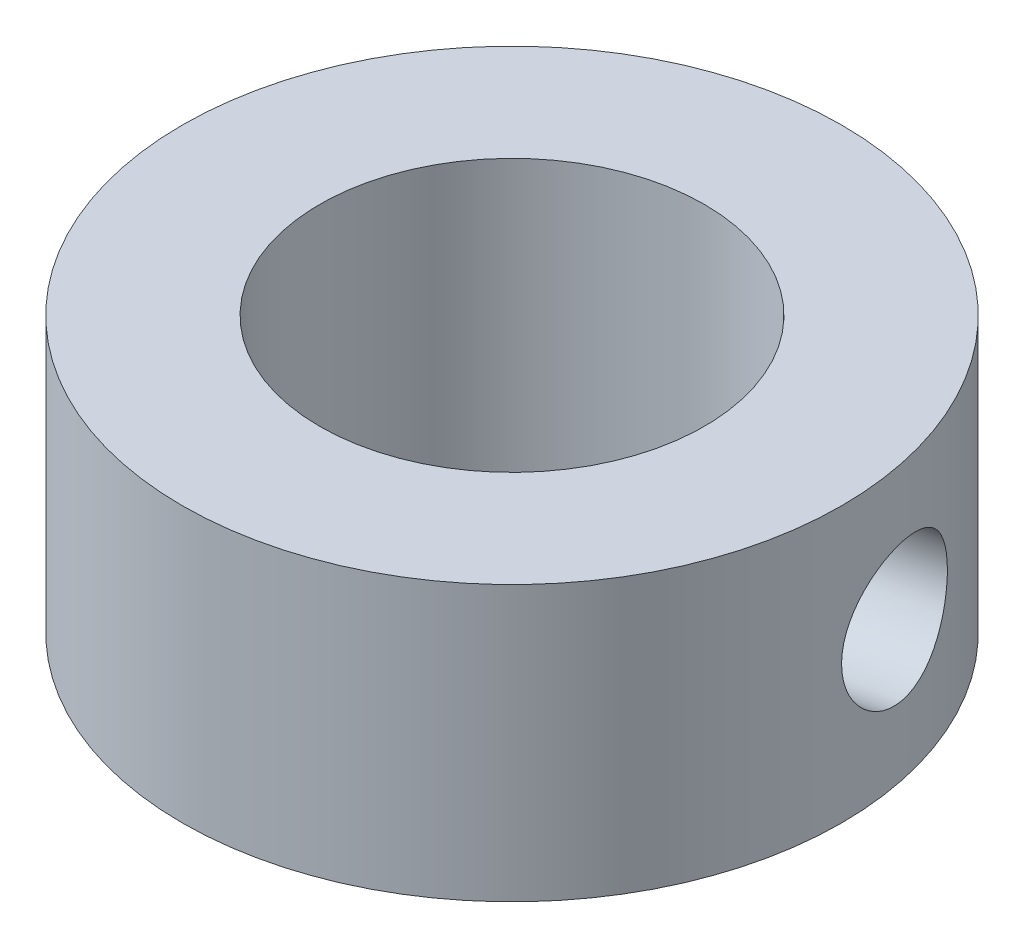
ISO-10303-21;
HEADER;
FILE_DESCRIPTION(('STEP AP214'),'2;1');
FILE_NAME('part.step','',(''),(''),'','','');
FILE_SCHEMA(('AUTOMOTIVE_DESIGN { 1 0 10303 214 1 1 1 1 }'));
ENDSEC;
DATA;
#1=APPLICATION_CONTEXT('core data for automotive mechanical design processes');
#2=APPLICATION_PROTOCOL_DEFINITION('international standard','automotive_design',2000,#1);
#3=PRODUCT_CONTEXT('',#1,'mechanical');
#4=PRODUCT('Part','Part','',(#3));
#5=PRODUCT_RELATED_PRODUCT_CATEGORY('part','',(#4));
#6=PRODUCT_DEFINITION_FORMATION('','',#4);
#7=PRODUCT_DEFINITION_CONTEXT('part definition',#1,'design');
#8=PRODUCT_DEFINITION('design','',#6,#7);
#9=PRODUCT_DEFINITION_SHAPE('','',#8);
#10=(LENGTH_UNIT() NAMED_UNIT(*) SI_UNIT(.MILLI.,.METRE.));
#11=(NAMED_UNIT(*) PLANE_ANGLE_UNIT() SI_UNIT($,.RADIAN.));
#12=(NAMED_UNIT(*) SI_UNIT($,.STERADIAN.) SOLID_ANGLE_UNIT());
#13=UNCERTAINTY_MEASURE_WITH_UNIT(LENGTH_MEASURE(1.E-05),#10,'distance_accuracy_value','');
#14=(GEOMETRIC_REPRESENTATION_CONTEXT(3) GLOBAL_UNCERTAINTY_ASSIGNED_CONTEXT((#13)) GLOBAL_UNIT_ASSIGNED_CONTEXT((#10,
#11,#12)) REPRESENTATION_CONTEXT('',''));
#15=CARTESIAN_POINT('',(0.,0.,0.));
#16=DIRECTION('',(0.,0.,1.));
#17=DIRECTION('',(1.,0.,0.));
#18=AXIS2_PLACEMENT_3D('',#15,#16,#17);
#19=CARTESIAN_POINT('',(0.,-2.5,0.));
#20=DIRECTION('',(0.,1.,0.));
#21=DIRECTION('',(0.,0.,1.));
#22=AXIS2_PLACEMENT_3D('',#19,#20,#21);
#23=CYLINDRICAL_SURFACE('',#22,6.);
#24=CARTESIAN_POINT('',(5.48018686270813,0.00576682418998756,-2.44285733308378));
#25=CARTESIAN_POINT('',(5.480188745192,0.0751574393410179,-2.44285518635812));
#26=CARTESIAN_POINT('',(5.48260932155722,0.144578796205205,-2.43744503012078));
#27=CARTESIAN_POINT('',(5.49211596825202,0.281453141507234,-2.41594603235458));
#28=CARTESIAN_POINT('',(5.49920561485061,0.348904579696409,-2.3998490051526));
#29=CARTESIAN_POINT('',(5.51751947502951,0.479839197024853,-2.35743680735912));
#30=CARTESIAN_POINT('',(5.52873939184858,0.543326420181788,-2.33113225422416));
#31=CARTESIAN_POINT('',(5.5545325227368,0.664691323835585,-2.26898553431602));
#32=CARTESIAN_POINT('',(5.56910560127513,0.722569230920001,-2.23314375301713));
#33=CARTESIAN_POINT('',(5.60087400937813,0.831962199343446,-2.15223601495975));
#34=CARTESIAN_POINT('',(5.61810267071982,0.883378717816451,-2.10704988697842));
#35=CARTESIAN_POINT('',(5.6539570815169,0.977527892838086,-2.00885450249342));
#36=CARTESIAN_POINT('',(5.67258293330265,1.02025991248142,-1.95584467270552));
#37=CARTESIAN_POINT('',(5.7103268013267,1.09621271227284,-1.84275588332418));
#38=CARTESIAN_POINT('',(5.72944781118457,1.12933935065324,-1.78261459316705));
#39=CARTESIAN_POINT('',(5.76695935684096,1.18453287704976,-1.65724328605607));
#40=CARTESIAN_POINT('',(5.78534996672065,1.20660088934351,-1.5920137871756));
#41=CARTESIAN_POINT('',(5.82024832095809,1.23874258530745,-1.45923012477788));
#42=CARTESIAN_POINT('',(5.83677917777288,1.24898284138515,-1.39172238288478));
#43=CARTESIAN_POINT('',(5.86759922523999,1.257698519947,-1.25545086410674));
#44=CARTESIAN_POINT('',(5.8818886493263,1.25617516838309,-1.18668721885169));
#45=CARTESIAN_POINT('',(5.90763261486716,1.24153222323324,-1.05098778415441));
#46=CARTESIAN_POINT('',(5.91912753406271,1.22859210523186,-0.984040167120459));
#47=CARTESIAN_POINT('',(5.93945567347088,1.19176819885868,-0.852806127702682));
#48=CARTESIAN_POINT('',(5.94828878092565,1.16788394698691,-0.788519818154838));
#49=CARTESIAN_POINT('',(5.96347693173968,1.10968677206448,-0.66400826765842));
#50=CARTESIAN_POINT('',(5.96981484217938,1.07530452998032,-0.603813374663948));
#51=CARTESIAN_POINT('',(5.98026166761122,0.997138821349569,-0.489654234609502));
#52=CARTESIAN_POINT('',(5.9843703052565,0.953354185983855,-0.435690763466279));
#53=CARTESIAN_POINT('',(5.99088315349346,0.856645199298929,-0.334572615068976));
#54=CARTESIAN_POINT('',(5.99325368687959,0.803563764208038,-0.28756588074519));
#55=CARTESIAN_POINT('',(5.9967136786699,0.690284775195184,-0.203028224177751));
#56=CARTESIAN_POINT('',(5.99780310853962,0.630087062802751,-0.165497513011501));
#57=CARTESIAN_POINT('',(5.9992364884655,0.504054569361187,-0.101037550078611));
#58=CARTESIAN_POINT('',(5.9995785823104,0.438206173496552,-0.0741348311170256));
#59=CARTESIAN_POINT('',(5.99995201536228,0.302875204820601,-0.0320039768628058));
#60=CARTESIAN_POINT('',(5.9999833988589,0.233393151381893,-0.0167741779604791));
#61=CARTESIAN_POINT('',(6.00000660457981,0.0941471178710808,0.00128507613293169));
#62=CARTESIAN_POINT('',(5.99999914937185,0.0244122396529572,0.00433916459763529));
#63=CARTESIAN_POINT('',(6.00000050232078,-0.114558987350153,-0.00144502637196968));
#64=CARTESIAN_POINT('',(6.00000930947147,-0.183795366712346,-0.0102825700340519));
#65=CARTESIAN_POINT('',(5.99988796244236,-0.319053691868134,-0.0393718780221903));
#66=CARTESIAN_POINT('',(5.9997592732638,-0.385101842988839,-0.0595022437398609));
#67=CARTESIAN_POINT('',(5.9990378132359,-0.512957165251613,-0.11040503184165));
#68=CARTESIAN_POINT('',(5.99844500141572,-0.574763961460411,-0.141178393611742));
#69=CARTESIAN_POINT('',(5.9963302270326,-0.693339617026238,-0.212894106781457));
#70=CARTESIAN_POINT('',(5.99479531180384,-0.750025380276178,-0.253973411915916));
#71=CARTESIAN_POINT('',(5.99025534927118,-0.85587642496507,-0.344825930197308));
#72=CARTESIAN_POINT('',(5.9872501370684,-0.905040862049237,-0.394600118102716));
#73=CARTESIAN_POINT('',(5.97918505602285,-0.99529588890717,-0.502299756657661));
#74=CARTESIAN_POINT('',(5.9740915792157,-1.03623727083639,-0.560347894355982));
#75=CARTESIAN_POINT('',(5.96140120259915,-1.10782192789799,-0.682234922633515));
#76=CARTESIAN_POINT('',(5.95380441343171,-1.13846565804746,-0.74607355719266));
#77=CARTESIAN_POINT('',(5.93588941298386,-1.18837185512735,-0.877250478372328));
#78=CARTESIAN_POINT('',(5.92558801701972,-1.20770234135435,-0.94456514508785));
#79=CARTESIAN_POINT('',(5.90221645118387,-1.2346475798181,-1.08103142468431));
#80=CARTESIAN_POINT('',(5.88914664487482,-1.24226386934274,-1.15018279531743));
#81=CARTESIAN_POINT('',(5.86076551941203,-1.24550079785852,-1.28693965516478));
#82=CARTESIAN_POINT('',(5.84550114983007,-1.24134507580474,-1.35454969259046));
#83=CARTESIAN_POINT('',(5.81306191747969,-1.22165253715708,-1.48761624305071));
#84=CARTESIAN_POINT('',(5.79588708305689,-1.20611588940324,-1.55307278801806));
#85=CARTESIAN_POINT('',(5.76041066491593,-1.16420538116145,-1.67987978964754));
#86=CARTESIAN_POINT('',(5.74211220593815,-1.1378605119569,-1.74124072406764));
#87=CARTESIAN_POINT('',(5.70524252999415,-1.075110778078,-1.85849114815427));
#88=CARTESIAN_POINT('',(5.68667128941191,-1.03870503746687,-1.91438016084095));
#89=CARTESIAN_POINT('',(5.64993472276439,-0.956123507816702,-2.02025644290511));
#90=CARTESIAN_POINT('',(5.63178206422843,-0.909788887753304,-2.07012423533986));
#91=CARTESIAN_POINT('',(5.59730436428489,-0.808988674812923,-2.16161512145977));
#92=CARTESIAN_POINT('',(5.58097975967722,-0.754521145861575,-2.20323624648511));
#93=CARTESIAN_POINT('',(5.55103024283003,-0.638224073376569,-2.27765134854929));
#94=CARTESIAN_POINT('',(5.53743970283042,-0.576314764347913,-2.31033459783291));
#95=CARTESIAN_POINT('',(5.51417141340633,-0.447408019726743,-2.36533559557017));
#96=CARTESIAN_POINT('',(5.50449021798526,-0.380415127357,-2.38766247551644));
#97=CARTESIAN_POINT('',(5.49155731882326,-0.260126894241575,-2.41722691819223));
#98=CARTESIAN_POINT('',(5.48731091157392,-0.207503639216957,-2.42682264950049));
#99=CARTESIAN_POINT('',(5.48162501349057,-0.101337395289001,-2.43963855712023));
#100=CARTESIAN_POINT('',(5.48018540965541,-0.0477944434999677,-2.44285899009961));
#101=CARTESIAN_POINT('',(5.48018686270813,0.00576682418998756,-2.44285733308378));
#102=B_SPLINE_CURVE_WITH_KNOTS('',3,(#24,#25,#26,#27,#28,#29,#30,#31,#32,#33,#34,#35,#36,#37,
#38,#39,#40,#41,#42,#43,#44,#45,#46,#47,#48,#49,#50,#51,#52,#53,#54,#55,#56,#57,#58,#59,#60,#61,
#62,#63,#64,#65,#66,#67,#68,#69,#70,#71,#72,#73,#74,#75,#76,#77,#78,#79,#80,#81,#82,#83,#84,#85,
#86,#87,#88,#89,#90,#91,#92,#93,#94,#95,#96,#97,#98,#99,#100,#101),.UNSPECIFIED.,.T.,.F.,(4,2,2,
2,2,2,2,2,2,2,2,2,2,2,2,2,2,2,2,2,2,2,2,2,2,2,2,2,2,2,2,2,2,2,2,2,2,2,4),(0.,0.207975654071268,
0.416110792417468,0.624030014802726,0.831940834815786,1.04271333467884,1.25350128663873,
1.46629026266843,1.67905760106932,1.88879048859263,2.09850151896338,2.3049734141646,
2.51145405455869,2.71932871977948,2.92722924104259,3.13905862244912,3.35089272191626,
3.56325237332486,3.77558175387595,3.9839751600979,4.19235567296522,4.3985378623192,
4.60473825464029,4.81383917934649,5.02296356082183,5.23559458753341,5.44821621759037,
5.65954599648532,5.87084803959578,6.07816293922642,6.28547476332978,6.49223410585098,
6.6990114552817,6.9093831897857,7.11980508427532,7.3327265135812,7.54545984571985,
7.70599867585766,7.86653104261157),.UNSPECIFIED.);
#103=CARTESIAN_POINT('',(5.48018686270813,0.00576682418998756,-2.44285733308378));
#104=VERTEX_POINT('',#103);
#105=EDGE_CURVE('E65',#104,#104,#102,.T.);
#106=ORIENTED_EDGE('',*,*,#105,.F.);
#107=EDGE_LOOP('',(#106));
#108=FACE_BOUND('',#107,.T.);
#109=CARTESIAN_POINT('',(0.,-2.5,0.));
#110=DIRECTION('',(0.,1.,0.));
#111=DIRECTION('',(0.,0.,1.));
#112=AXIS2_PLACEMENT_3D('',#109,#110,#111);
#113=CIRCLE('',#112,6.);
#114=CARTESIAN_POINT('',(0.,-2.5,6.));
#115=VERTEX_POINT('',#114);
#116=EDGE_CURVE('E10',#115,#115,#113,.T.);
#117=ORIENTED_EDGE('',*,*,#116,.T.);
#118=EDGE_LOOP('',(#117));
#119=FACE_BOUND('',#118,.T.);
#120=CARTESIAN_POINT('',(0.,2.5,0.));
#121=DIRECTION('',(0.,1.,0.));
#122=DIRECTION('',(0.,0.,1.));
#123=AXIS2_PLACEMENT_3D('',#120,#121,#122);
#124=CIRCLE('',#123,6.);
#125=CARTESIAN_POINT('',(0.,2.5,6.));
#126=VERTEX_POINT('',#125);
#127=EDGE_CURVE('E54',#126,#126,#124,.T.);
#128=ORIENTED_EDGE('',*,*,#127,.F.);
#129=EDGE_LOOP('',(#128));
#130=FACE_BOUND('',#129,.T.);
#131=ADVANCED_FACE('F41',(#108,#119,#130),#23,.T.);
#132=CARTESIAN_POINT('',(0.,-2.5,0.));
#133=DIRECTION('',(0.,1.,0.));
#134=DIRECTION('',(0.,0.,1.));
#135=AXIS2_PLACEMENT_3D('',#132,#133,#134);
#136=PLANE('',#135);
#137=CARTESIAN_POINT('',(0.,-2.5,0.));
#138=DIRECTION('',(0.,1.,0.));
#139=DIRECTION('',(0.,0.,1.));
#140=AXIS2_PLACEMENT_3D('',#137,#138,#139);
#141=CIRCLE('',#140,3.5);
#142=CARTESIAN_POINT('',(0.,-2.5,3.5));
#143=VERTEX_POINT('',#142);
#144=EDGE_CURVE('E49',#143,#143,#141,.T.);
#145=ORIENTED_EDGE('',*,*,#144,.T.);
#146=EDGE_LOOP('',(#145));
#147=FACE_BOUND('',#146,.T.);
#148=ORIENTED_EDGE('',*,*,#116,.F.);
#149=EDGE_LOOP('',(#148));
#150=FACE_BOUND('',#149,.T.);
#151=ADVANCED_FACE('F91',(#147,#150),#136,.F.);
#152=CARTESIAN_POINT('',(0.,-2.5,0.));
#153=DIRECTION('',(0.,1.,0.));
#154=DIRECTION('',(0.,0.,1.));
#155=AXIS2_PLACEMENT_3D('',#152,#153,#154);
#156=CYLINDRICAL_SURFACE('',#155,3.5);
#157=CARTESIAN_POINT('',(2.937819319828,0.00576682418998756,-1.90242414935402));
#158=CARTESIAN_POINT('',(2.93781775984147,0.0735303553729763,-1.90242531621251));
#159=CARTESIAN_POINT('',(2.94105220019301,0.141283755968707,-1.89745908062386));
#160=CARTESIAN_POINT('',(2.95366418514508,0.274763283654477,-1.8777652518889));
#161=CARTESIAN_POINT('',(2.96304203315586,0.340489310448818,-1.863037176625));
#162=CARTESIAN_POINT('',(2.98704122912983,0.46795420372794,-1.82430728767309));
#163=CARTESIAN_POINT('',(3.00165104063548,0.52970149261602,-1.80032586862701));
#164=CARTESIAN_POINT('',(3.03490551051833,0.647897258584727,-1.74368104500843));
#165=CARTESIAN_POINT('',(3.05355125015449,0.704344309865416,-1.71101531329952));
#166=CARTESIAN_POINT('',(3.09432845422509,0.812877423646292,-1.63615927400415));
#167=CARTESIAN_POINT('',(3.11657128120323,0.864690755221937,-1.59363409963802));
#168=CARTESIAN_POINT('',(3.16236887517473,0.960020248530514,-1.50070112970238));
#169=CARTESIAN_POINT('',(3.18592388876497,1.00353484385389,-1.45029184924767));
#170=CARTESIAN_POINT('',(3.23351695368992,1.08231136761636,-1.34090540643389));
#171=CARTESIAN_POINT('',(3.25754786582852,1.1172815704051,-1.28171404877127));
#172=CARTESIAN_POINT('',(3.30377236174393,1.17603435191693,-1.15735890580632));
#173=CARTESIAN_POINT('',(3.32596651751313,1.19982042442388,-1.09219699324198));
#174=CARTESIAN_POINT('',(3.3663466233761,1.23458729859002,-0.96035083536179));
#175=CARTESIAN_POINT('',(3.38465622954999,1.24603660430774,-0.893828273926257));
#176=CARTESIAN_POINT('',(3.41744112666199,1.25730101910383,-0.758888144530763));
#177=CARTESIAN_POINT('',(3.43191754803162,1.25711956201658,-0.69047114184312));
#178=CARTESIAN_POINT('',(3.45603516806746,1.24541122540767,-0.55697285834047));
#179=CARTESIAN_POINT('',(3.46586442356514,1.2343945709989,-0.491879844259738));
#180=CARTESIAN_POINT('',(3.48164155951219,1.20218039861841,-0.363784000881929));
#181=CARTESIAN_POINT('',(3.48758916887508,1.18098216976511,-0.300781317861019));
#182=CARTESIAN_POINT('',(3.49603738953981,1.12874336627707,-0.177717305013828));
#183=CARTESIAN_POINT('',(3.49848849392499,1.09756894069237,-0.117709611044011));
#184=CARTESIAN_POINT('',(3.50046831034485,1.02637725414102,-0.00313597333138881));
#185=CARTESIAN_POINT('',(3.49999613066696,0.986357298542184,0.051428304805194));
#186=CARTESIAN_POINT('',(3.49691588161599,0.896101436222664,0.156489970809369));
#187=CARTESIAN_POINT('',(3.49419484091013,0.845433373217749,0.206613352942566));
#188=CARTESIAN_POINT('',(3.48760375289932,0.736595080480582,0.297855077915416));
#189=CARTESIAN_POINT('',(3.48373347009344,0.678423314484292,0.338971572073681));
#190=CARTESIAN_POINT('',(3.47592211310142,0.554827998212104,0.411491485430968));
#191=CARTESIAN_POINT('',(3.47198105257853,0.489290290908064,0.44270134257673));
#192=CARTESIAN_POINT('',(3.46519465108953,0.3536770981426,0.49303006576103));
#193=CARTESIAN_POINT('',(3.46234876830526,0.283603876637099,0.512154913640437));
#194=CARTESIAN_POINT('',(3.45862075660076,0.144724881322057,0.536740287793797));
#195=CARTESIAN_POINT('',(3.45764610941543,0.0760359178553749,0.542846333570383));
#196=CARTESIAN_POINT('',(3.45761808935505,-0.0613498634227573,0.543027075561152));
#197=CARTESIAN_POINT('',(3.45856429771255,-0.130046676258059,0.537104394168973));
#198=CARTESIAN_POINT('',(3.46206679703246,-0.262520063172562,0.51402166619943));
#199=CARTESIAN_POINT('',(3.46455471266033,-0.326382547598178,0.497337665641862));
#200=CARTESIAN_POINT('',(3.4705127085323,-0.450528133307116,0.45389304638761));
#201=CARTESIAN_POINT('',(3.47398297839967,-0.510810540809702,0.427130481901764));
#202=CARTESIAN_POINT('',(3.48123798359184,-0.628433264553967,0.3633771441515));
#203=CARTESIAN_POINT('',(3.48502948031955,-0.685596138701284,0.326060441737192));
#204=CARTESIAN_POINT('',(3.49181563610079,-0.793337036211547,0.242826383316323));
#205=CARTESIAN_POINT('',(3.49481002696348,-0.843912840401291,0.196906141431319));
#206=CARTESIAN_POINT('',(3.4991053239387,-0.940004520808116,0.0949078155935243));
#207=CARTESIAN_POINT('',(3.50030095312591,-0.985072868541369,0.03840231396437));
#208=CARTESIAN_POINT('',(3.49956818941753,-1.06537951833536,-0.0812040378993997));
#209=CARTESIAN_POINT('',(3.49763984874273,-1.10061798470247,-0.144304777870435));
#210=CARTESIAN_POINT('',(3.48979450481104,-1.15998328751409,-0.274934197694692));
#211=CARTESIAN_POINT('',(3.48389800865521,-1.18416618454034,-0.342438508546438));
#212=CARTESIAN_POINT('',(3.46761448979917,-1.22075660533859,-0.480041881822921));
#213=CARTESIAN_POINT('',(3.4572293607965,-1.23316908785425,-0.550139838630012));
#214=CARTESIAN_POINT('',(3.43260743437272,-1.24536965913217,-0.686857742914841));
#215=CARTESIAN_POINT('',(3.41860581284256,-1.24579622903447,-0.753463622082698));
#216=CARTESIAN_POINT('',(3.38695405522717,-1.23562548731664,-0.884936476325251));
#217=CARTESIAN_POINT('',(3.36930429258869,-1.22502930360777,-0.949803628619805));
#218=CARTESIAN_POINT('',(3.33154824282514,-1.19355311116221,-1.07469060113195));
#219=CARTESIAN_POINT('',(3.31149956572101,-1.17288781412577,-1.13478241679731));
#220=CARTESIAN_POINT('',(3.2696899920659,-1.12206663044455,-1.25015867397707));
#221=CARTESIAN_POINT('',(3.24792877525276,-1.09190896545321,-1.30544221220631));
#222=CARTESIAN_POINT('',(3.20300034837934,-1.02157749964809,-1.41218888755379));
#223=CARTESIAN_POINT('',(3.17981173277267,-0.981050938260792,-1.4634103564525));
#224=CARTESIAN_POINT('',(3.13430583111856,-0.89170694621416,-1.55849622596154));
#225=CARTESIAN_POINT('',(3.11198884607861,-0.842886682018343,-1.60235810195919));
#226=CARTESIAN_POINT('',(3.06873292233103,-0.735623762222946,-1.68377688240652));
#227=CARTESIAN_POINT('',(3.04790699250128,-0.676838237100545,-1.72094373715408));
#228=CARTESIAN_POINT('',(3.0105489058898,-0.552863968654632,-1.78549492999961));
#229=CARTESIAN_POINT('',(2.99401645946087,-0.487675657685296,-1.81287992804849));
#230=CARTESIAN_POINT('',(2.96672349764337,-0.352362713891387,-1.85721260890839));
#231=CARTESIAN_POINT('',(2.95598714712591,-0.282218772623819,-1.87411663764382));
#232=CARTESIAN_POINT('',(2.94153765636257,-0.139456229041206,-1.89671897073721));
#233=CARTESIAN_POINT('',(2.93782099128652,-0.0668388873664198,-1.90242289911529));
#234=CARTESIAN_POINT('',(2.937819319828,0.00576682418998756,-1.90242414935402));
#235=B_SPLINE_CURVE_WITH_KNOTS('',3,(#157,#158,#159,#160,#161,#162,#163,#164,#165,#166,#167,
#168,#169,#170,#171,#172,#173,#174,#175,#176,#177,#178,#179,#180,#181,#182,#183,#184,#185,#186,
#187,#188,#189,#190,#191,#192,#193,#194,#195,#196,#197,#198,#199,#200,#201,#202,#203,#204,#205,
#206,#207,#208,#209,#210,#211,#212,#213,#214,#215,#216,#217,#218,#219,#220,#221,#222,#223,#224,
#225,#226,#227,#228,#229,#230,#231,#232,#233,#234),.UNSPECIFIED.,.T.,.F.,(4,2,2,2,2,2,2,2,2,2,2,
2,2,2,2,2,2,2,2,2,2,2,2,2,2,2,2,2,2,2,2,2,2,2,2,2,2,2,4),(0.,0.203020883138163,
0.406051793815669,0.608637751162814,0.811278050310591,1.02220501259777,1.233171748617,
1.45056406841854,1.66788843235754,1.87663230111989,2.08531454120125,2.28461868668641,
2.4839367496896,2.68604985529559,2.88822461610464,3.10122083881641,3.31426073854219,
3.5312380464741,3.7481078706226,3.95394726789475,4.15974179475172,4.35700470913188,
4.55430572705355,4.75852942964239,4.96282175786676,5.17866024153269,5.39449511724436,
5.6092230554341,5.82386049090845,6.02704135069303,6.23020142189362,6.42920732216893,
6.62825052739446,6.8352650805038,7.04235050272172,7.25910581081147,7.47584649234331,
7.69348395638326,7.91101210793799),.UNSPECIFIED.);
#236=CARTESIAN_POINT('',(2.937819319828,0.00576682418998756,-1.90242414935402));
#237=VERTEX_POINT('',#236);
#238=EDGE_CURVE('E73',#237,#237,#235,.T.);
#239=ORIENTED_EDGE('',*,*,#238,.T.);
#240=EDGE_LOOP('',(#239));
#241=FACE_BOUND('',#240,.T.);
#242=ORIENTED_EDGE('',*,*,#144,.F.);
#243=EDGE_LOOP('',(#242));
#244=FACE_BOUND('',#243,.T.);
#245=CARTESIAN_POINT('',(0.,2.5,0.));
#246=DIRECTION('',(0.,1.,0.));
#247=DIRECTION('',(0.,0.,1.));
#248=AXIS2_PLACEMENT_3D('',#245,#246,#247);
#249=CIRCLE('',#248,3.5);
#250=CARTESIAN_POINT('',(0.,2.5,3.5));
#251=VERTEX_POINT('',#250);
#252=EDGE_CURVE('E59',#251,#251,#249,.T.);
#253=ORIENTED_EDGE('',*,*,#252,.T.);
#254=EDGE_LOOP('',(#253));
#255=FACE_BOUND('',#254,.T.);
#256=ADVANCED_FACE('F88',(#241,#244,#255),#156,.F.);
#257=CARTESIAN_POINT('',(0.,2.5,0.));
#258=DIRECTION('',(0.,1.,0.));
#259=DIRECTION('',(0.,0.,1.));
#260=AXIS2_PLACEMENT_3D('',#257,#258,#259);
#261=PLANE('',#260);
#262=ORIENTED_EDGE('',*,*,#127,.T.);
#263=EDGE_LOOP('',(#262));
#264=FACE_BOUND('',#263,.T.);
#265=ORIENTED_EDGE('',*,*,#252,.F.);
#266=EDGE_LOOP('',(#265));
#267=FACE_BOUND('',#266,.T.);
#268=ADVANCED_FACE('F81',(#264,#267),#261,.T.);
#269=CARTESIAN_POINT('',(5.86886857167,0.00576682418998756,-1.24755027492448));
#270=DIRECTION('',(0.978144761945,0.,-0.207925045820747));
#271=DIRECTION('',(-0.207925045820747,0.,-0.978144761945));
#272=AXIS2_PLACEMENT_3D('',#269,#270,#271);
#273=CYLINDRICAL_SURFACE('',#272,1.24999999999999);
#274=ORIENTED_EDGE('',*,*,#105,.T.);
#275=EDGE_LOOP('',(#274));
#276=FACE_BOUND('',#275,.T.);
#277=ORIENTED_EDGE('',*,*,#238,.F.);
#278=EDGE_LOOP('',(#277));
#279=FACE_BOUND('',#278,.T.);
#280=ADVANCED_FACE('F78',(#276,#279),#273,.F.);
#281=CLOSED_SHELL('',(#131,#151,#256,#268,#280));
#282=MANIFOLD_SOLID_BREP('B2',#281);
#283=ADVANCED_BREP_SHAPE_REPRESENTATION('',(#18,#282),#14);
#284=SHAPE_DEFINITION_REPRESENTATION(#9,#283);
ENDSEC;
END-ISO-10303-21;
